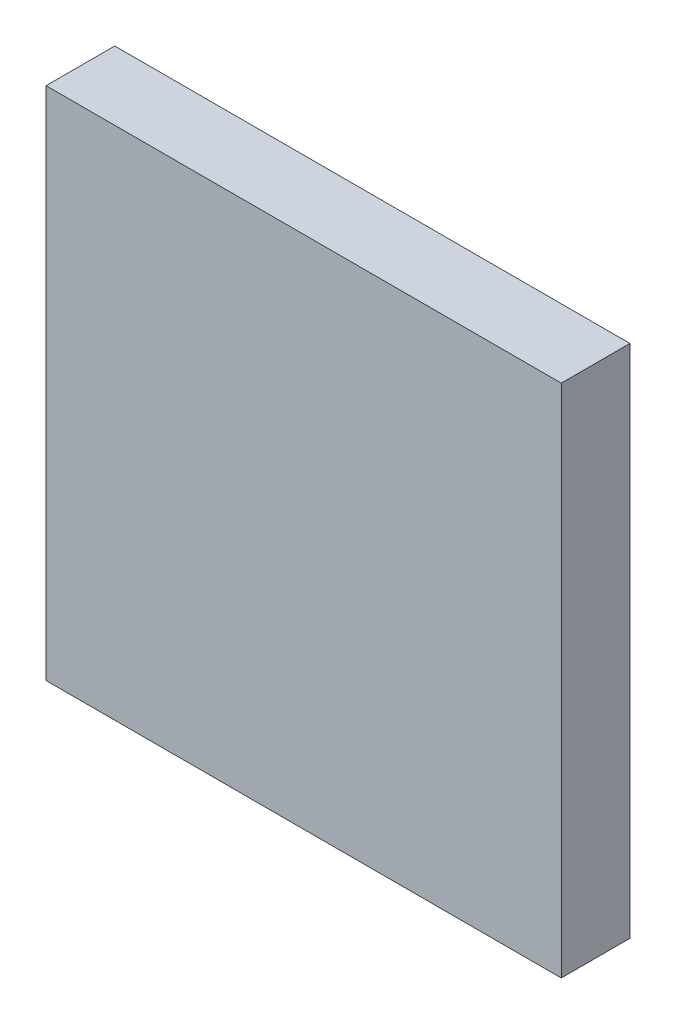
ISO-10303-21;
HEADER;
FILE_DESCRIPTION(('STEP AP214'),'2;1');
FILE_NAME('part.step','',(''),(''),'','','');
FILE_SCHEMA(('AUTOMOTIVE_DESIGN { 1 0 10303 214 1 1 1 1 }'));
ENDSEC;
DATA;
#1=APPLICATION_CONTEXT('core data for automotive mechanical design processes');
#2=APPLICATION_PROTOCOL_DEFINITION('international standard','automotive_design',2000,#1);
#3=PRODUCT_CONTEXT('',#1,'mechanical');
#4=PRODUCT('Part','Part','',(#3));
#5=PRODUCT_RELATED_PRODUCT_CATEGORY('part','',(#4));
#6=PRODUCT_DEFINITION_FORMATION('','',#4);
#7=PRODUCT_DEFINITION_CONTEXT('part definition',#1,'design');
#8=PRODUCT_DEFINITION('design','',#6,#7);
#9=PRODUCT_DEFINITION_SHAPE('','',#8);
#10=(LENGTH_UNIT() NAMED_UNIT(*) SI_UNIT(.MILLI.,.METRE.));
#11=(NAMED_UNIT(*) PLANE_ANGLE_UNIT() SI_UNIT($,.RADIAN.));
#12=(NAMED_UNIT(*) SI_UNIT($,.STERADIAN.) SOLID_ANGLE_UNIT());
#13=UNCERTAINTY_MEASURE_WITH_UNIT(LENGTH_MEASURE(1.E-05),#10,'distance_accuracy_value','');
#14=(GEOMETRIC_REPRESENTATION_CONTEXT(3) GLOBAL_UNCERTAINTY_ASSIGNED_CONTEXT((#13)) GLOBAL_UNIT_ASSIGNED_CONTEXT((#10,
#11,#12)) REPRESENTATION_CONTEXT('',''));
#15=CARTESIAN_POINT('',(0.,0.,0.));
#16=DIRECTION('',(0.,0.,1.));
#17=DIRECTION('',(1.,0.,0.));
#18=AXIS2_PLACEMENT_3D('',#15,#16,#17);
#19=CARTESIAN_POINT('',(60.,-60.,16.));
#20=DIRECTION('',(-1.,0.,0.));
#21=DIRECTION('',(0.,0.,1.));
#22=AXIS2_PLACEMENT_3D('',#19,#20,#21);
#23=PLANE('',#22);
#24=DIRECTION('',(0.,1.,0.));
#25=VECTOR('',#24,1.);
#26=CARTESIAN_POINT('',(60.,-60.,0.));
#27=LINE('',#26,#25);
#28=CARTESIAN_POINT('',(60.,-60.,0.));
#29=VERTEX_POINT('',#28);
#30=CARTESIAN_POINT('',(60.,60.,0.));
#31=VERTEX_POINT('',#30);
#32=EDGE_CURVE('E98',#29,#31,#27,.T.);
#33=ORIENTED_EDGE('',*,*,#32,.T.);
#34=DIRECTION('',(0.,0.,-1.));
#35=VECTOR('',#34,1.);
#36=CARTESIAN_POINT('',(60.,60.,16.));
#37=LINE('',#36,#35);
#38=CARTESIAN_POINT('',(60.,60.,16.));
#39=VERTEX_POINT('',#38);
#40=EDGE_CURVE('E11',#39,#31,#37,.T.);
#41=ORIENTED_EDGE('',*,*,#40,.F.);
#42=DIRECTION('',(0.,1.,0.));
#43=VECTOR('',#42,1.);
#44=CARTESIAN_POINT('',(60.,-60.,16.));
#45=LINE('',#44,#43);
#46=CARTESIAN_POINT('',(60.,-60.,16.));
#47=VERTEX_POINT('',#46);
#48=EDGE_CURVE('E86',#47,#39,#45,.T.);
#49=ORIENTED_EDGE('',*,*,#48,.F.);
#50=DIRECTION('',(0.,0.,-1.));
#51=VECTOR('',#50,1.);
#52=CARTESIAN_POINT('',(60.,-60.,16.));
#53=LINE('',#52,#51);
#54=EDGE_CURVE('E94',#47,#29,#53,.T.);
#55=ORIENTED_EDGE('',*,*,#54,.T.);
#56=EDGE_LOOP('',(#33,#41,#49,#55));
#57=FACE_BOUND('',#56,.T.);
#58=ADVANCED_FACE('F35',(#57),#23,.F.);
#59=CARTESIAN_POINT('',(-60.,60.,16.));
#60=DIRECTION('',(0.,-1.,0.));
#61=DIRECTION('',(0.,0.,-1.));
#62=AXIS2_PLACEMENT_3D('',#59,#60,#61);
#63=PLANE('',#62);
#64=DIRECTION('',(-1.,0.,0.));
#65=VECTOR('',#64,1.);
#66=CARTESIAN_POINT('',(-60.,60.,0.));
#67=LINE('',#66,#65);
#68=CARTESIAN_POINT('',(-60.,60.,0.));
#69=VERTEX_POINT('',#68);
#70=EDGE_CURVE('E90',#31,#69,#67,.T.);
#71=ORIENTED_EDGE('',*,*,#70,.T.);
#72=DIRECTION('',(0.,0.,-1.));
#73=VECTOR('',#72,1.);
#74=CARTESIAN_POINT('',(-60.,60.,16.));
#75=LINE('',#74,#73);
#76=CARTESIAN_POINT('',(-60.,60.,16.));
#77=VERTEX_POINT('',#76);
#78=EDGE_CURVE('E43',#77,#69,#75,.T.);
#79=ORIENTED_EDGE('',*,*,#78,.F.);
#80=DIRECTION('',(-1.,0.,0.));
#81=VECTOR('',#80,1.);
#82=CARTESIAN_POINT('',(-60.,60.,16.));
#83=LINE('',#82,#81);
#84=EDGE_CURVE('E81',#39,#77,#83,.T.);
#85=ORIENTED_EDGE('',*,*,#84,.F.);
#86=ORIENTED_EDGE('',*,*,#40,.T.);
#87=EDGE_LOOP('',(#71,#79,#85,#86));
#88=FACE_BOUND('',#87,.T.);
#89=ADVANCED_FACE('F89',(#88),#63,.F.);
#90=CARTESIAN_POINT('',(-60.,-60.,16.));
#91=DIRECTION('',(1.,0.,0.));
#92=DIRECTION('',(0.,0.,-1.));
#93=AXIS2_PLACEMENT_3D('',#90,#91,#92);
#94=PLANE('',#93);
#95=DIRECTION('',(0.,-1.,0.));
#96=VECTOR('',#95,1.);
#97=CARTESIAN_POINT('',(-60.,-60.,0.));
#98=LINE('',#97,#96);
#99=CARTESIAN_POINT('',(-60.,-60.,0.));
#100=VERTEX_POINT('',#99);
#101=EDGE_CURVE('E68',#69,#100,#98,.T.);
#102=ORIENTED_EDGE('',*,*,#101,.T.);
#103=DIRECTION('',(0.,0.,-1.));
#104=VECTOR('',#103,1.);
#105=CARTESIAN_POINT('',(-60.,-60.,16.));
#106=LINE('',#105,#104);
#107=CARTESIAN_POINT('',(-60.,-60.,16.));
#108=VERTEX_POINT('',#107);
#109=EDGE_CURVE('E91',#108,#100,#106,.T.);
#110=ORIENTED_EDGE('',*,*,#109,.F.);
#111=DIRECTION('',(0.,-1.,0.));
#112=VECTOR('',#111,1.);
#113=CARTESIAN_POINT('',(-60.,-60.,16.));
#114=LINE('',#113,#112);
#115=EDGE_CURVE('E84',#77,#108,#114,.T.);
#116=ORIENTED_EDGE('',*,*,#115,.F.);
#117=ORIENTED_EDGE('',*,*,#78,.T.);
#118=EDGE_LOOP('',(#102,#110,#116,#117));
#119=FACE_BOUND('',#118,.T.);
#120=ADVANCED_FACE('F92',(#119),#94,.F.);
#121=CARTESIAN_POINT('',(-60.,-60.,16.));
#122=DIRECTION('',(0.,1.,0.));
#123=DIRECTION('',(0.,0.,1.));
#124=AXIS2_PLACEMENT_3D('',#121,#122,#123);
#125=PLANE('',#124);
#126=DIRECTION('',(1.,0.,0.));
#127=VECTOR('',#126,1.);
#128=CARTESIAN_POINT('',(-60.,-60.,0.));
#129=LINE('',#128,#127);
#130=EDGE_CURVE('E74',#100,#29,#129,.T.);
#131=ORIENTED_EDGE('',*,*,#130,.T.);
#132=ORIENTED_EDGE('',*,*,#54,.F.);
#133=DIRECTION('',(1.,0.,0.));
#134=VECTOR('',#133,1.);
#135=CARTESIAN_POINT('',(-60.,-60.,16.));
#136=LINE('',#135,#134);
#137=EDGE_CURVE('E51',#108,#47,#136,.T.);
#138=ORIENTED_EDGE('',*,*,#137,.F.);
#139=ORIENTED_EDGE('',*,*,#109,.T.);
#140=EDGE_LOOP('',(#131,#132,#138,#139));
#141=FACE_BOUND('',#140,.T.);
#142=ADVANCED_FACE('F105',(#141),#125,.F.);
#143=CARTESIAN_POINT('',(0.,0.,16.));
#144=DIRECTION('',(0.,0.,-1.));
#145=DIRECTION('',(-1.,0.,0.));
#146=AXIS2_PLACEMENT_3D('',#143,#144,#145);
#147=PLANE('',#146);
#148=ORIENTED_EDGE('',*,*,#48,.T.);
#149=ORIENTED_EDGE('',*,*,#84,.T.);
#150=ORIENTED_EDGE('',*,*,#115,.T.);
#151=ORIENTED_EDGE('',*,*,#137,.T.);
#152=EDGE_LOOP('',(#148,#149,#150,#151));
#153=FACE_BOUND('',#152,.T.);
#154=ADVANCED_FACE('F82',(#153),#147,.F.);
#155=CARTESIAN_POINT('',(0.,0.,0.));
#156=DIRECTION('',(0.,0.,-1.));
#157=DIRECTION('',(-1.,0.,0.));
#158=AXIS2_PLACEMENT_3D('',#155,#156,#157);
#159=PLANE('',#158);
#160=ORIENTED_EDGE('',*,*,#32,.F.);
#161=ORIENTED_EDGE('',*,*,#130,.F.);
#162=ORIENTED_EDGE('',*,*,#101,.F.);
#163=ORIENTED_EDGE('',*,*,#70,.F.);
#164=EDGE_LOOP('',(#160,#161,#162,#163));
#165=FACE_BOUND('',#164,.T.);
#166=ADVANCED_FACE('F108',(#165),#159,.T.);
#167=CLOSED_SHELL('',(#58,#89,#120,#142,#154,#166));
#168=MANIFOLD_SOLID_BREP('B2',#167);
#169=ADVANCED_BREP_SHAPE_REPRESENTATION('',(#18,#168),#14);
#170=SHAPE_DEFINITION_REPRESENTATION(#9,#169);
ENDSEC;
END-ISO-10303-21;
